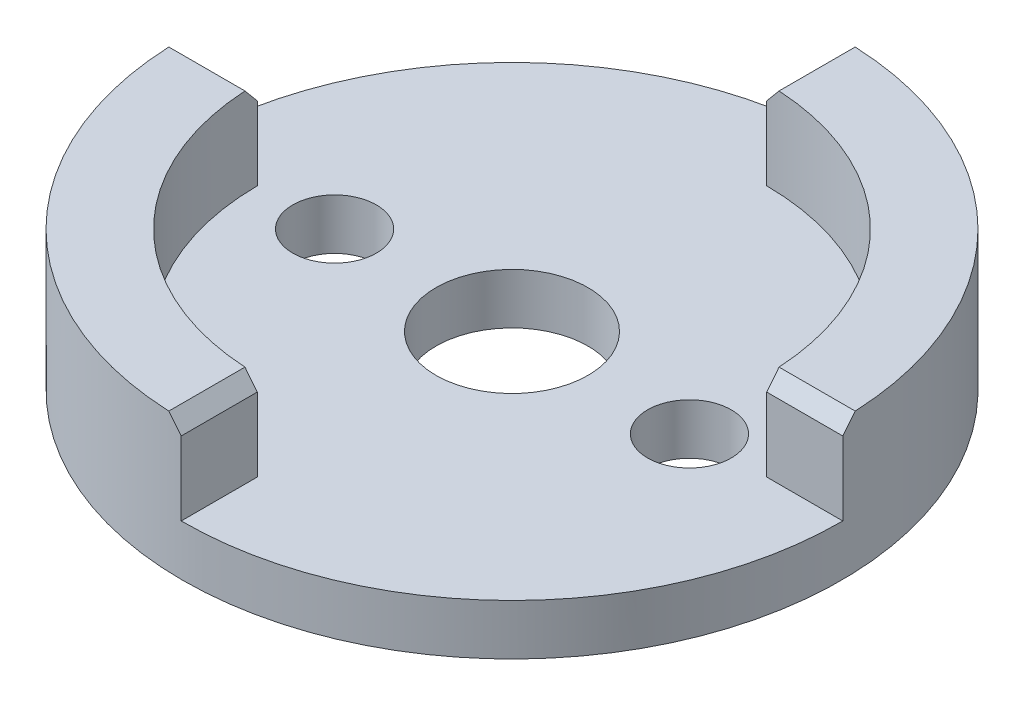
ISO-10303-21;
HEADER;
FILE_DESCRIPTION(('STEP AP214'),'2;1');
FILE_NAME('part.step','',(''),(''),'','','');
FILE_SCHEMA(('AUTOMOTIVE_DESIGN { 1 0 10303 214 1 1 1 1 }'));
ENDSEC;
DATA;
#1=APPLICATION_CONTEXT('core data for automotive mechanical design processes');
#2=APPLICATION_PROTOCOL_DEFINITION('international standard','automotive_design',2000,#1);
#3=PRODUCT_CONTEXT('',#1,'mechanical');
#4=PRODUCT('Part','Part','',(#3));
#5=PRODUCT_RELATED_PRODUCT_CATEGORY('part','',(#4));
#6=PRODUCT_DEFINITION_FORMATION('','',#4);
#7=PRODUCT_DEFINITION_CONTEXT('part definition',#1,'design');
#8=PRODUCT_DEFINITION('design','',#6,#7);
#9=PRODUCT_DEFINITION_SHAPE('','',#8);
#10=(LENGTH_UNIT() NAMED_UNIT(*) SI_UNIT(.MILLI.,.METRE.));
#11=(NAMED_UNIT(*) PLANE_ANGLE_UNIT() SI_UNIT($,.RADIAN.));
#12=(NAMED_UNIT(*) SI_UNIT($,.STERADIAN.) SOLID_ANGLE_UNIT());
#13=UNCERTAINTY_MEASURE_WITH_UNIT(LENGTH_MEASURE(1.E-05),#10,'distance_accuracy_value','');
#14=(GEOMETRIC_REPRESENTATION_CONTEXT(3) GLOBAL_UNCERTAINTY_ASSIGNED_CONTEXT((#13)) GLOBAL_UNIT_ASSIGNED_CONTEXT((#10,
#11,#12)) REPRESENTATION_CONTEXT('',''));
#15=CARTESIAN_POINT('',(0.,0.,0.));
#16=DIRECTION('',(0.,0.,1.));
#17=DIRECTION('',(1.,0.,0.));
#18=AXIS2_PLACEMENT_3D('',#15,#16,#17);
#19=CARTESIAN_POINT('',(0.,2.,0.));
#20=DIRECTION('',(0.,1.,0.));
#21=DIRECTION('',(0.,0.,1.));
#22=AXIS2_PLACEMENT_3D('',#19,#20,#21);
#23=PLANE('',#22);
#24=DIRECTION('',(1.,0.,0.));
#25=VECTOR('',#24,1.);
#26=CARTESIAN_POINT('',(0.,2.,0.0499999999999984));
#27=LINE('',#26,#25);
#28=CARTESIAN_POINT('',(-12.9999038457982,2.,0.0500000000000024));
#29=VERTEX_POINT('',#28);
#30=CARTESIAN_POINT('',(-9.99987499921874,2.,0.0500000000000015));
#31=VERTEX_POINT('',#30);
#32=EDGE_CURVE('E177',#29,#31,#27,.T.);
#33=ORIENTED_EDGE('',*,*,#32,.T.);
#34=CARTESIAN_POINT('',(0.,2.,0.));
#35=DIRECTION('',(0.,1.,0.));
#36=DIRECTION('',(0.,0.,1.));
#37=AXIS2_PLACEMENT_3D('',#34,#35,#36);
#38=CIRCLE('',#37,10.);
#39=CARTESIAN_POINT('',(-0.0499999999999993,2.,9.99987499921874));
#40=VERTEX_POINT('',#39);
#41=EDGE_CURVE('E174',#31,#40,#38,.T.);
#42=ORIENTED_EDGE('',*,*,#41,.T.);
#43=DIRECTION('',(0.,0.,-1.));
#44=VECTOR('',#43,1.);
#45=CARTESIAN_POINT('',(-0.0500000000000022,2.,0.));
#46=LINE('',#45,#44);
#47=CARTESIAN_POINT('',(-0.0499999999999984,2.,12.9999038457982));
#48=VERTEX_POINT('',#47);
#49=EDGE_CURVE('E147',#48,#40,#46,.T.);
#50=ORIENTED_EDGE('',*,*,#49,.F.);
#51=CARTESIAN_POINT('',(0.,2.,0.));
#52=DIRECTION('',(0.,1.,0.));
#53=DIRECTION('',(0.,0.,1.));
#54=AXIS2_PLACEMENT_3D('',#51,#52,#53);
#55=CIRCLE('',#54,13.);
#56=CARTESIAN_POINT('',(12.9999038457982,2.,-0.0500000000000008));
#57=VERTEX_POINT('',#56);
#58=EDGE_CURVE('E157',#48,#57,#55,.T.);
#59=ORIENTED_EDGE('',*,*,#58,.T.);
#60=DIRECTION('',(-1.,0.,0.));
#61=VECTOR('',#60,1.);
#62=CARTESIAN_POINT('',(0.,2.,-0.0499999999999989));
#63=LINE('',#62,#61);
#64=CARTESIAN_POINT('',(9.99987499921874,2.,-0.0500000000000003));
#65=VERTEX_POINT('',#64);
#66=EDGE_CURVE('E207',#57,#65,#63,.T.);
#67=ORIENTED_EDGE('',*,*,#66,.T.);
#68=CARTESIAN_POINT('',(0.,2.,0.));
#69=DIRECTION('',(0.,1.,0.));
#70=DIRECTION('',(0.,0.,1.));
#71=AXIS2_PLACEMENT_3D('',#68,#69,#70);
#72=CIRCLE('',#71,10.);
#73=CARTESIAN_POINT('',(0.0500000000000005,2.,-9.99987499921874));
#74=VERTEX_POINT('',#73);
#75=EDGE_CURVE('E193',#65,#74,#72,.T.);
#76=ORIENTED_EDGE('',*,*,#75,.T.);
#77=DIRECTION('',(0.,0.,1.));
#78=VECTOR('',#77,1.);
#79=CARTESIAN_POINT('',(0.0500000000000019,2.,0.));
#80=LINE('',#79,#78);
#81=CARTESIAN_POINT('',(0.05,2.,-12.9999038457982));
#82=VERTEX_POINT('',#81);
#83=EDGE_CURVE('E199',#82,#74,#80,.T.);
#84=ORIENTED_EDGE('',*,*,#83,.F.);
#85=EDGE_CURVE('E167',#82,#29,#55,.T.);
#86=ORIENTED_EDGE('',*,*,#85,.T.);
#87=EDGE_LOOP('',(#33,#42,#50,#59,#67,#76,#84,#86));
#88=FACE_BOUND('',#87,.T.);
#89=CARTESIAN_POINT('',(-7.,2.,0.));
#90=DIRECTION('',(0.,1.,0.));
#91=DIRECTION('',(0.,0.,1.));
#92=AXIS2_PLACEMENT_3D('',#89,#90,#91);
#93=CIRCLE('',#92,1.65);
#94=CARTESIAN_POINT('',(-7.,2.,1.65));
#95=VERTEX_POINT('',#94);
#96=EDGE_CURVE('E232',#95,#95,#93,.T.);
#97=ORIENTED_EDGE('',*,*,#96,.F.);
#98=EDGE_LOOP('',(#97));
#99=FACE_BOUND('',#98,.T.);
#100=CARTESIAN_POINT('',(7.,2.,0.));
#101=DIRECTION('',(0.,1.,0.));
#102=DIRECTION('',(0.,0.,1.));
#103=AXIS2_PLACEMENT_3D('',#100,#101,#102);
#104=CIRCLE('',#103,1.65);
#105=CARTESIAN_POINT('',(7.,2.,1.65));
#106=VERTEX_POINT('',#105);
#107=EDGE_CURVE('E240',#106,#106,#104,.T.);
#108=ORIENTED_EDGE('',*,*,#107,.F.);
#109=EDGE_LOOP('',(#108));
#110=FACE_BOUND('',#109,.T.);
#111=CARTESIAN_POINT('',(0.,2.,0.));
#112=DIRECTION('',(0.,1.,0.));
#113=DIRECTION('',(0.,0.,1.));
#114=AXIS2_PLACEMENT_3D('',#111,#112,#113);
#115=CIRCLE('',#114,3.);
#116=CARTESIAN_POINT('',(0.,2.,3.));
#117=VERTEX_POINT('',#116);
#118=EDGE_CURVE('E224',#117,#117,#115,.T.);
#119=ORIENTED_EDGE('',*,*,#118,.F.);
#120=EDGE_LOOP('',(#119));
#121=FACE_BOUND('',#120,.T.);
#122=ADVANCED_FACE('F51',(#88,#99,#110,#121),#23,.T.);
#123=CARTESIAN_POINT('',(0.,0.,0.));
#124=DIRECTION('',(0.,1.,0.));
#125=DIRECTION('',(0.,0.,1.));
#126=AXIS2_PLACEMENT_3D('',#123,#124,#125);
#127=PLANE('',#126);
#128=CARTESIAN_POINT('',(0.,0.,0.));
#129=DIRECTION('',(0.,1.,0.));
#130=DIRECTION('',(0.,0.,1.));
#131=AXIS2_PLACEMENT_3D('',#128,#129,#130);
#132=CIRCLE('',#131,13.);
#133=CARTESIAN_POINT('',(0.,0.,13.));
#134=VERTEX_POINT('',#133);
#135=EDGE_CURVE('E168',#134,#134,#132,.T.);
#136=ORIENTED_EDGE('',*,*,#135,.F.);
#137=EDGE_LOOP('',(#136));
#138=FACE_BOUND('',#137,.T.);
#139=CARTESIAN_POINT('',(7.,0.,0.));
#140=DIRECTION('',(0.,1.,0.));
#141=DIRECTION('',(0.,0.,1.));
#142=AXIS2_PLACEMENT_3D('',#139,#140,#141);
#143=CIRCLE('',#142,1.65);
#144=CARTESIAN_POINT('',(7.,0.,1.65));
#145=VERTEX_POINT('',#144);
#146=EDGE_CURVE('E236',#145,#145,#143,.T.);
#147=ORIENTED_EDGE('',*,*,#146,.T.);
#148=EDGE_LOOP('',(#147));
#149=FACE_BOUND('',#148,.T.);
#150=CARTESIAN_POINT('',(-7.,0.,0.));
#151=DIRECTION('',(0.,1.,0.));
#152=DIRECTION('',(0.,0.,1.));
#153=AXIS2_PLACEMENT_3D('',#150,#151,#152);
#154=CIRCLE('',#153,1.65);
#155=CARTESIAN_POINT('',(-7.,0.,1.65));
#156=VERTEX_POINT('',#155);
#157=EDGE_CURVE('E228',#156,#156,#154,.T.);
#158=ORIENTED_EDGE('',*,*,#157,.T.);
#159=EDGE_LOOP('',(#158));
#160=FACE_BOUND('',#159,.T.);
#161=CARTESIAN_POINT('',(0.,0.,0.));
#162=DIRECTION('',(0.,1.,0.));
#163=DIRECTION('',(0.,0.,1.));
#164=AXIS2_PLACEMENT_3D('',#161,#162,#163);
#165=CIRCLE('',#164,3.);
#166=CARTESIAN_POINT('',(0.,0.,3.));
#167=VERTEX_POINT('',#166);
#168=EDGE_CURVE('E223',#167,#167,#165,.T.);
#169=ORIENTED_EDGE('',*,*,#168,.T.);
#170=EDGE_LOOP('',(#169));
#171=FACE_BOUND('',#170,.T.);
#172=ADVANCED_FACE('F323',(#138,#149,#160,#171),#127,.F.);
#173=CARTESIAN_POINT('',(0.,2.,0.));
#174=DIRECTION('',(0.,-1.,0.));
#175=DIRECTION('',(0.,0.,-1.));
#176=AXIS2_PLACEMENT_3D('',#173,#174,#175);
#177=CYLINDRICAL_SURFACE('',#176,13.);
#178=DIRECTION('',(0.,-1.,0.));
#179=VECTOR('',#178,1.);
#180=CARTESIAN_POINT('',(0.05,5.5,-12.9999038457982));
#181=LINE('',#180,#179);
#182=CARTESIAN_POINT('',(0.05,4.9041232037029,-12.9999038457982));
#183=VERTEX_POINT('',#182);
#184=EDGE_CURVE('E215',#183,#82,#181,.T.);
#185=ORIENTED_EDGE('',*,*,#184,.F.);
#186=CARTESIAN_POINT('',(0.,4.84453552407318,0.));
#187=DIRECTION('',(-0.766044443118977,0.642787609686541,0.));
#188=DIRECTION('',(-0.642787609686541,-0.766044443118977,0.));
#189=AXIS2_PLACEMENT_3D('',#186,#187,#188);
#190=ELLIPSE('',#189,20.2244097491853,13.);
#191=CARTESIAN_POINT('',(0.55,5.5,-12.9883601736324));
#192=VERTEX_POINT('',#191);
#193=EDGE_CURVE('E277',#183,#192,#190,.F.);
#194=ORIENTED_EDGE('',*,*,#193,.T.);
#195=CARTESIAN_POINT('',(0.,5.5,0.));
#196=DIRECTION('',(0.,1.,0.));
#197=DIRECTION('',(0.,0.,1.));
#198=AXIS2_PLACEMENT_3D('',#195,#196,#197);
#199=CIRCLE('',#198,13.);
#200=CARTESIAN_POINT('',(12.9883601736324,5.5,-0.550000000000005));
#201=VERTEX_POINT('',#200);
#202=EDGE_CURVE('E198',#201,#192,#199,.T.);
#203=ORIENTED_EDGE('',*,*,#202,.F.);
#204=CARTESIAN_POINT('',(0.,4.84453552407318,0.));
#205=DIRECTION('',(0.,-0.642787609686541,-0.766044443118977));
#206=DIRECTION('',(0.,-0.766044443118977,0.642787609686541));
#207=AXIS2_PLACEMENT_3D('',#204,#205,#206);
#208=ELLIPSE('',#207,20.2244097491853,13.);
#209=CARTESIAN_POINT('',(12.9999038457982,4.90412320370289,-0.0500000000000008));
#210=VERTEX_POINT('',#209);
#211=EDGE_CURVE('E268',#201,#210,#208,.T.);
#212=ORIENTED_EDGE('',*,*,#211,.T.);
#213=DIRECTION('',(0.,-1.,0.));
#214=VECTOR('',#213,1.);
#215=CARTESIAN_POINT('',(12.9999038457982,5.5,-0.0500000000000008));
#216=LINE('',#215,#214);
#217=EDGE_CURVE('E162',#210,#57,#216,.T.);
#218=ORIENTED_EDGE('',*,*,#217,.T.);
#219=ORIENTED_EDGE('',*,*,#58,.F.);
#220=DIRECTION('',(0.,-1.,0.));
#221=VECTOR('',#220,1.);
#222=CARTESIAN_POINT('',(-0.0499999999999984,5.5,12.9999038457982));
#223=LINE('',#222,#221);
#224=CARTESIAN_POINT('',(-0.0499999999999984,4.9041232037029,12.9999038457982));
#225=VERTEX_POINT('',#224);
#226=EDGE_CURVE('E143',#225,#48,#223,.T.);
#227=ORIENTED_EDGE('',*,*,#226,.F.);
#228=CARTESIAN_POINT('',(0.,4.84453552407318,0.));
#229=DIRECTION('',(0.766044443118977,0.642787609686541,0.));
#230=DIRECTION('',(0.642787609686541,-0.766044443118977,0.));
#231=AXIS2_PLACEMENT_3D('',#228,#229,#230);
#232=ELLIPSE('',#231,20.2244097491853,13.);
#233=CARTESIAN_POINT('',(-0.549999999999999,5.5,12.9883601736324));
#234=VERTEX_POINT('',#233);
#235=EDGE_CURVE('E274',#225,#234,#232,.F.);
#236=ORIENTED_EDGE('',*,*,#235,.T.);
#237=CARTESIAN_POINT('',(0.,5.5,0.));
#238=DIRECTION('',(0.,1.,0.));
#239=DIRECTION('',(0.,0.,1.));
#240=AXIS2_PLACEMENT_3D('',#237,#238,#239);
#241=CIRCLE('',#240,13.);
#242=CARTESIAN_POINT('',(-12.9883601736324,5.5,0.550000000000003));
#243=VERTEX_POINT('',#242);
#244=EDGE_CURVE('E180',#243,#234,#241,.T.);
#245=ORIENTED_EDGE('',*,*,#244,.F.);
#246=CARTESIAN_POINT('',(0.,4.84453552407319,0.));
#247=DIRECTION('',(0.,-0.642787609686541,0.766044443118977));
#248=DIRECTION('',(0.,-0.766044443118977,-0.642787609686541));
#249=AXIS2_PLACEMENT_3D('',#246,#247,#248);
#250=ELLIPSE('',#249,20.2244097491853,13.);
#251=CARTESIAN_POINT('',(-12.9999038457982,4.9041232037029,0.0500000000000024));
#252=VERTEX_POINT('',#251);
#253=EDGE_CURVE('E271',#243,#252,#250,.T.);
#254=ORIENTED_EDGE('',*,*,#253,.T.);
#255=DIRECTION('',(0.,-1.,0.));
#256=VECTOR('',#255,1.);
#257=CARTESIAN_POINT('',(-12.9999038457982,5.5,0.0500000000000024));
#258=LINE('',#257,#256);
#259=EDGE_CURVE('E153',#252,#29,#258,.T.);
#260=ORIENTED_EDGE('',*,*,#259,.T.);
#261=ORIENTED_EDGE('',*,*,#85,.F.);
#262=EDGE_LOOP('',(#185,#194,#203,#212,#218,#219,#227,#236,#245,#254,#260,#261));
#263=FACE_BOUND('',#262,.T.);
#264=ORIENTED_EDGE('',*,*,#135,.T.);
#265=EDGE_LOOP('',(#264));
#266=FACE_BOUND('',#265,.T.);
#267=ADVANCED_FACE('F159',(#263,#266),#177,.T.);
#268=CARTESIAN_POINT('',(7.,2.,0.));
#269=DIRECTION('',(0.,-1.,0.));
#270=DIRECTION('',(0.,0.,-1.));
#271=AXIS2_PLACEMENT_3D('',#268,#269,#270);
#272=CYLINDRICAL_SURFACE('',#271,1.65);
#273=ORIENTED_EDGE('',*,*,#107,.T.);
#274=EDGE_LOOP('',(#273));
#275=FACE_BOUND('',#274,.T.);
#276=ORIENTED_EDGE('',*,*,#146,.F.);
#277=EDGE_LOOP('',(#276));
#278=FACE_BOUND('',#277,.T.);
#279=ADVANCED_FACE('F331',(#275,#278),#272,.F.);
#280=CARTESIAN_POINT('',(-7.,2.,0.));
#281=DIRECTION('',(0.,-1.,0.));
#282=DIRECTION('',(0.,0.,-1.));
#283=AXIS2_PLACEMENT_3D('',#280,#281,#282);
#284=CYLINDRICAL_SURFACE('',#283,1.65);
#285=ORIENTED_EDGE('',*,*,#96,.T.);
#286=EDGE_LOOP('',(#285));
#287=FACE_BOUND('',#286,.T.);
#288=ORIENTED_EDGE('',*,*,#157,.F.);
#289=EDGE_LOOP('',(#288));
#290=FACE_BOUND('',#289,.T.);
#291=ADVANCED_FACE('F348',(#287,#290),#284,.F.);
#292=CARTESIAN_POINT('',(0.,2.,0.));
#293=DIRECTION('',(0.,-1.,0.));
#294=DIRECTION('',(0.,0.,-1.));
#295=AXIS2_PLACEMENT_3D('',#292,#293,#294);
#296=CYLINDRICAL_SURFACE('',#295,3.);
#297=ORIENTED_EDGE('',*,*,#118,.T.);
#298=EDGE_LOOP('',(#297));
#299=FACE_BOUND('',#298,.T.);
#300=ORIENTED_EDGE('',*,*,#168,.F.);
#301=EDGE_LOOP('',(#300));
#302=FACE_BOUND('',#301,.T.);
#303=ADVANCED_FACE('F353',(#299,#302),#296,.F.);
#304=CARTESIAN_POINT('',(0.,5.5,0.));
#305=DIRECTION('',(0.,-1.,0.));
#306=DIRECTION('',(0.,0.,-1.));
#307=AXIS2_PLACEMENT_3D('',#304,#305,#306);
#308=CYLINDRICAL_SURFACE('',#307,10.);
#309=CARTESIAN_POINT('',(0.,5.5,0.));
#310=DIRECTION('',(0.,1.,0.));
#311=DIRECTION('',(0.,0.,1.));
#312=AXIS2_PLACEMENT_3D('',#309,#310,#311);
#313=CIRCLE('',#312,10.);
#314=CARTESIAN_POINT('',(9.98486354438557,5.5,-0.550000000000004));
#315=VERTEX_POINT('',#314);
#316=CARTESIAN_POINT('',(0.550000000000001,5.5,-9.98486354438557));
#317=VERTEX_POINT('',#316);
#318=EDGE_CURVE('E194',#315,#317,#313,.T.);
#319=ORIENTED_EDGE('',*,*,#318,.T.);
#320=CARTESIAN_POINT('',(0.,4.84453552407318,0.));
#321=DIRECTION('',(-0.766044443118977,0.642787609686541,0.));
#322=DIRECTION('',(-0.642787609686541,-0.766044443118977,0.));
#323=AXIS2_PLACEMENT_3D('',#320,#321,#322);
#324=ELLIPSE('',#323,15.5572382686041,10.);
#325=CARTESIAN_POINT('',(0.0500000000000005,4.9041232037029,-9.99987499921874));
#326=VERTEX_POINT('',#325);
#327=EDGE_CURVE('E262',#317,#326,#324,.T.);
#328=ORIENTED_EDGE('',*,*,#327,.T.);
#329=DIRECTION('',(0.,-1.,0.));
#330=VECTOR('',#329,1.);
#331=CARTESIAN_POINT('',(0.0500000000000005,5.5,-9.99987499921874));
#332=LINE('',#331,#330);
#333=EDGE_CURVE('E203',#326,#74,#332,.T.);
#334=ORIENTED_EDGE('',*,*,#333,.T.);
#335=ORIENTED_EDGE('',*,*,#75,.F.);
#336=DIRECTION('',(0.,-1.,0.));
#337=VECTOR('',#336,1.);
#338=CARTESIAN_POINT('',(9.99987499921874,5.5,-0.0500000000000003));
#339=LINE('',#338,#337);
#340=CARTESIAN_POINT('',(9.99987499921874,4.90412320370289,-0.0500000000000003));
#341=VERTEX_POINT('',#340);
#342=EDGE_CURVE('E220',#341,#65,#339,.T.);
#343=ORIENTED_EDGE('',*,*,#342,.F.);
#344=CARTESIAN_POINT('',(0.,4.84453552407318,0.));
#345=DIRECTION('',(0.,-0.642787609686541,-0.766044443118977));
#346=DIRECTION('',(0.,-0.766044443118977,0.642787609686541));
#347=AXIS2_PLACEMENT_3D('',#344,#345,#346);
#348=ELLIPSE('',#347,15.5572382686041,10.);
#349=EDGE_CURVE('E259',#341,#315,#348,.F.);
#350=ORIENTED_EDGE('',*,*,#349,.T.);
#351=EDGE_LOOP('',(#319,#328,#334,#335,#343,#350));
#352=FACE_BOUND('',#351,.T.);
#353=ADVANCED_FACE('F365',(#352),#308,.F.);
#354=CARTESIAN_POINT('',(0.,5.5,-0.0499999999999989));
#355=DIRECTION('',(0.,0.,1.));
#356=DIRECTION('',(1.,0.,0.));
#357=AXIS2_PLACEMENT_3D('',#354,#355,#356);
#358=PLANE('',#357);
#359=ORIENTED_EDGE('',*,*,#217,.F.);
#360=DIRECTION('',(-1.,0.,0.));
#361=VECTOR('',#360,1.);
#362=CARTESIAN_POINT('',(0.,4.90412320370289,-0.0499999999999989));
#363=LINE('',#362,#361);
#364=EDGE_CURVE('E11',#210,#341,#363,.T.);
#365=ORIENTED_EDGE('',*,*,#364,.T.);
#366=ORIENTED_EDGE('',*,*,#342,.T.);
#367=ORIENTED_EDGE('',*,*,#66,.F.);
#368=EDGE_LOOP('',(#359,#365,#366,#367));
#369=FACE_BOUND('',#368,.T.);
#370=ADVANCED_FACE('F371',(#369),#358,.T.);
#371=CARTESIAN_POINT('',(0.0500000000000019,5.5,0.));
#372=DIRECTION('',(1.,0.,0.));
#373=DIRECTION('',(0.,0.,-1.));
#374=AXIS2_PLACEMENT_3D('',#371,#372,#373);
#375=PLANE('',#374);
#376=ORIENTED_EDGE('',*,*,#333,.F.);
#377=DIRECTION('',(0.,0.,-1.));
#378=VECTOR('',#377,1.);
#379=CARTESIAN_POINT('',(0.05,4.9041232037029,-12.9999038457982));
#380=LINE('',#379,#378);
#381=EDGE_CURVE('E265',#326,#183,#380,.T.);
#382=ORIENTED_EDGE('',*,*,#381,.T.);
#383=ORIENTED_EDGE('',*,*,#184,.T.);
#384=ORIENTED_EDGE('',*,*,#83,.T.);
#385=EDGE_LOOP('',(#376,#382,#383,#384));
#386=FACE_BOUND('',#385,.T.);
#387=ADVANCED_FACE('F377',(#386),#375,.F.);
#388=CARTESIAN_POINT('',(0.,5.5,0.));
#389=DIRECTION('',(0.,1.,0.));
#390=DIRECTION('',(0.,0.,1.));
#391=AXIS2_PLACEMENT_3D('',#388,#389,#390);
#392=PLANE('',#391);
#393=ORIENTED_EDGE('',*,*,#202,.T.);
#394=DIRECTION('',(0.,0.,1.));
#395=VECTOR('',#394,1.);
#396=CARTESIAN_POINT('',(0.550000000000001,5.5,-9.99987499921874));
#397=LINE('',#396,#395);
#398=EDGE_CURVE('E255',#192,#317,#397,.T.);
#399=ORIENTED_EDGE('',*,*,#398,.T.);
#400=ORIENTED_EDGE('',*,*,#318,.F.);
#401=DIRECTION('',(1.,0.,0.));
#402=VECTOR('',#401,1.);
#403=CARTESIAN_POINT('',(0.,5.5,-0.550000000000003));
#404=LINE('',#403,#402);
#405=EDGE_CURVE('E249',#315,#201,#404,.T.);
#406=ORIENTED_EDGE('',*,*,#405,.T.);
#407=EDGE_LOOP('',(#393,#399,#400,#406));
#408=FACE_BOUND('',#407,.T.);
#409=ADVANCED_FACE('F381',(#408),#392,.T.);
#410=CARTESIAN_POINT('',(0.,5.5,0.));
#411=DIRECTION('',(0.,-1.,0.));
#412=DIRECTION('',(0.,0.,-1.));
#413=AXIS2_PLACEMENT_3D('',#410,#411,#412);
#414=CYLINDRICAL_SURFACE('',#413,10.);
#415=CARTESIAN_POINT('',(0.,5.5,0.));
#416=DIRECTION('',(0.,1.,0.));
#417=DIRECTION('',(0.,0.,1.));
#418=AXIS2_PLACEMENT_3D('',#415,#416,#417);
#419=CIRCLE('',#418,10.);
#420=CARTESIAN_POINT('',(-9.98486354438557,5.5,0.550000000000002));
#421=VERTEX_POINT('',#420);
#422=CARTESIAN_POINT('',(-0.55,5.5,9.98486354438557));
#423=VERTEX_POINT('',#422);
#424=EDGE_CURVE('E176',#421,#423,#419,.T.);
#425=ORIENTED_EDGE('',*,*,#424,.T.);
#426=CARTESIAN_POINT('',(0.,4.84453552407318,0.));
#427=DIRECTION('',(0.766044443118977,0.642787609686541,0.));
#428=DIRECTION('',(0.642787609686541,-0.766044443118977,0.));
#429=AXIS2_PLACEMENT_3D('',#426,#427,#428);
#430=ELLIPSE('',#429,15.5572382686041,10.);
#431=CARTESIAN_POINT('',(-0.0499999999999993,4.9041232037029,9.99987499921874));
#432=VERTEX_POINT('',#431);
#433=EDGE_CURVE('E68',#423,#432,#430,.T.);
#434=ORIENTED_EDGE('',*,*,#433,.T.);
#435=DIRECTION('',(0.,-1.,0.));
#436=VECTOR('',#435,1.);
#437=CARTESIAN_POINT('',(-0.0499999999999993,5.5,9.99987499921874));
#438=LINE('',#437,#436);
#439=EDGE_CURVE('E154',#432,#40,#438,.T.);
#440=ORIENTED_EDGE('',*,*,#439,.T.);
#441=ORIENTED_EDGE('',*,*,#41,.F.);
#442=DIRECTION('',(0.,-1.,0.));
#443=VECTOR('',#442,1.);
#444=CARTESIAN_POINT('',(-9.99987499921874,5.5,0.0500000000000015));
#445=LINE('',#444,#443);
#446=CARTESIAN_POINT('',(-9.99987499921874,4.9041232037029,0.0500000000000015));
#447=VERTEX_POINT('',#446);
#448=EDGE_CURVE('E190',#447,#31,#445,.T.);
#449=ORIENTED_EDGE('',*,*,#448,.F.);
#450=CARTESIAN_POINT('',(0.,4.84453552407319,0.));
#451=DIRECTION('',(0.,-0.642787609686541,0.766044443118977));
#452=DIRECTION('',(0.,-0.766044443118977,-0.642787609686541));
#453=AXIS2_PLACEMENT_3D('',#450,#451,#452);
#454=ELLIPSE('',#453,15.5572382686041,10.);
#455=EDGE_CURVE('E76',#447,#421,#454,.F.);
#456=ORIENTED_EDGE('',*,*,#455,.T.);
#457=EDGE_LOOP('',(#425,#434,#440,#441,#449,#456));
#458=FACE_BOUND('',#457,.T.);
#459=ADVANCED_FACE('F299',(#458),#414,.F.);
#460=CARTESIAN_POINT('',(0.,5.5,0.0499999999999984));
#461=DIRECTION('',(0.,0.,-1.));
#462=DIRECTION('',(-1.,0.,0.));
#463=AXIS2_PLACEMENT_3D('',#460,#461,#462);
#464=PLANE('',#463);
#465=ORIENTED_EDGE('',*,*,#259,.F.);
#466=DIRECTION('',(1.,0.,0.));
#467=VECTOR('',#466,1.);
#468=CARTESIAN_POINT('',(0.,4.9041232037029,0.0499999999999984));
#469=LINE('',#468,#467);
#470=EDGE_CURVE('E61',#252,#447,#469,.T.);
#471=ORIENTED_EDGE('',*,*,#470,.T.);
#472=ORIENTED_EDGE('',*,*,#448,.T.);
#473=ORIENTED_EDGE('',*,*,#32,.F.);
#474=EDGE_LOOP('',(#465,#471,#472,#473));
#475=FACE_BOUND('',#474,.T.);
#476=ADVANCED_FACE('F296',(#475),#464,.T.);
#477=CARTESIAN_POINT('',(-0.0500000000000022,5.5,0.));
#478=DIRECTION('',(-1.,0.,0.));
#479=DIRECTION('',(0.,0.,1.));
#480=AXIS2_PLACEMENT_3D('',#477,#478,#479);
#481=PLANE('',#480);
#482=ORIENTED_EDGE('',*,*,#439,.F.);
#483=DIRECTION('',(0.,0.,1.));
#484=VECTOR('',#483,1.);
#485=CARTESIAN_POINT('',(-0.0499999999999984,4.9041232037029,12.9999038457982));
#486=LINE('',#485,#484);
#487=EDGE_CURVE('E149',#432,#225,#486,.T.);
#488=ORIENTED_EDGE('',*,*,#487,.T.);
#489=ORIENTED_EDGE('',*,*,#226,.T.);
#490=ORIENTED_EDGE('',*,*,#49,.T.);
#491=EDGE_LOOP('',(#482,#488,#489,#490));
#492=FACE_BOUND('',#491,.T.);
#493=ADVANCED_FACE('F145',(#492),#481,.F.);
#494=CARTESIAN_POINT('',(0.,5.5,0.));
#495=DIRECTION('',(0.,1.,0.));
#496=DIRECTION('',(0.,0.,1.));
#497=AXIS2_PLACEMENT_3D('',#494,#495,#496);
#498=PLANE('',#497);
#499=ORIENTED_EDGE('',*,*,#244,.T.);
#500=DIRECTION('',(0.,0.,-1.));
#501=VECTOR('',#500,1.);
#502=CARTESIAN_POINT('',(-0.55,5.5,9.99987499921874));
#503=LINE('',#502,#501);
#504=EDGE_CURVE('E283',#234,#423,#503,.T.);
#505=ORIENTED_EDGE('',*,*,#504,.T.);
#506=ORIENTED_EDGE('',*,*,#424,.F.);
#507=DIRECTION('',(-1.,0.,0.));
#508=VECTOR('',#507,1.);
#509=CARTESIAN_POINT('',(0.,5.5,0.549999999999999));
#510=LINE('',#509,#508);
#511=EDGE_CURVE('E280',#421,#243,#510,.T.);
#512=ORIENTED_EDGE('',*,*,#511,.T.);
#513=EDGE_LOOP('',(#499,#505,#506,#512));
#514=FACE_BOUND('',#513,.T.);
#515=ADVANCED_FACE('F308',(#514),#498,.T.);
#516=CARTESIAN_POINT('',(0.550000000000002,5.5,0.));
#517=DIRECTION('',(-0.766044443118977,0.642787609686541,0.));
#518=DIRECTION('',(0.,0.,-1.));
#519=AXIS2_PLACEMENT_3D('',#516,#517,#518);
#520=PLANE('',#519);
#521=ORIENTED_EDGE('',*,*,#193,.F.);
#522=ORIENTED_EDGE('',*,*,#381,.F.);
#523=ORIENTED_EDGE('',*,*,#327,.F.);
#524=ORIENTED_EDGE('',*,*,#398,.F.);
#525=EDGE_LOOP('',(#521,#522,#523,#524));
#526=FACE_BOUND('',#525,.T.);
#527=ADVANCED_FACE('F313',(#526),#520,.T.);
#528=CARTESIAN_POINT('',(-0.550000000000003,5.5,0.));
#529=DIRECTION('',(0.766044443118977,0.642787609686541,0.));
#530=DIRECTION('',(0.,0.,1.));
#531=AXIS2_PLACEMENT_3D('',#528,#529,#530);
#532=PLANE('',#531);
#533=ORIENTED_EDGE('',*,*,#235,.F.);
#534=ORIENTED_EDGE('',*,*,#487,.F.);
#535=ORIENTED_EDGE('',*,*,#433,.F.);
#536=ORIENTED_EDGE('',*,*,#504,.F.);
#537=EDGE_LOOP('',(#533,#534,#535,#536));
#538=FACE_BOUND('',#537,.T.);
#539=ADVANCED_FACE('F310',(#538),#532,.T.);
#540=CARTESIAN_POINT('',(0.,4.9041232037029,0.0499999999999984));
#541=DIRECTION('',(0.,-0.642787609686541,0.766044443118977));
#542=DIRECTION('',(1.,0.,0.));
#543=AXIS2_PLACEMENT_3D('',#540,#541,#542);
#544=PLANE('',#543);
#545=ORIENTED_EDGE('',*,*,#253,.F.);
#546=ORIENTED_EDGE('',*,*,#511,.F.);
#547=ORIENTED_EDGE('',*,*,#455,.F.);
#548=ORIENTED_EDGE('',*,*,#470,.F.);
#549=EDGE_LOOP('',(#545,#546,#547,#548));
#550=FACE_BOUND('',#549,.T.);
#551=ADVANCED_FACE('F312',(#550),#544,.F.);
#552=CARTESIAN_POINT('',(0.,4.90412320370289,-0.0499999999999989));
#553=DIRECTION('',(0.,-0.642787609686541,-0.766044443118977));
#554=DIRECTION('',(-1.,0.,0.));
#555=AXIS2_PLACEMENT_3D('',#552,#553,#554);
#556=PLANE('',#555);
#557=ORIENTED_EDGE('',*,*,#211,.F.);
#558=ORIENTED_EDGE('',*,*,#405,.F.);
#559=ORIENTED_EDGE('',*,*,#349,.F.);
#560=ORIENTED_EDGE('',*,*,#364,.F.);
#561=EDGE_LOOP('',(#557,#558,#559,#560));
#562=FACE_BOUND('',#561,.T.);
#563=ADVANCED_FACE('F54',(#562),#556,.F.);
#564=CLOSED_SHELL('',(#122,#172,#267,#279,#291,#303,#353,#370,#387,#409,#459,#476,#493,#515,
#527,#539,#551,#563));
#565=MANIFOLD_SOLID_BREP('B2',#564);
#566=ADVANCED_BREP_SHAPE_REPRESENTATION('',(#18,#565),#14);
#567=SHAPE_DEFINITION_REPRESENTATION(#9,#566);
ENDSEC;
END-ISO-10303-21;
